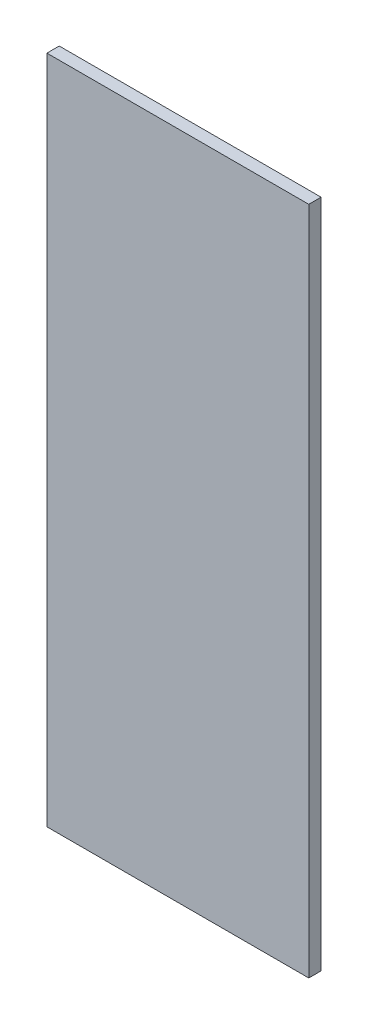
ISO-10303-21;
HEADER;
FILE_DESCRIPTION(('STEP AP214'),'2;1');
FILE_NAME('part.step','',(''),(''),'','','');
FILE_SCHEMA(('AUTOMOTIVE_DESIGN { 1 0 10303 214 1 1 1 1 }'));
ENDSEC;
DATA;
#1=APPLICATION_CONTEXT('core data for automotive mechanical design processes');
#2=APPLICATION_PROTOCOL_DEFINITION('international standard','automotive_design',2000,#1);
#3=PRODUCT_CONTEXT('',#1,'mechanical');
#4=PRODUCT('Part','Part','',(#3));
#5=PRODUCT_RELATED_PRODUCT_CATEGORY('part','',(#4));
#6=PRODUCT_DEFINITION_FORMATION('','',#4);
#7=PRODUCT_DEFINITION_CONTEXT('part definition',#1,'design');
#8=PRODUCT_DEFINITION('design','',#6,#7);
#9=PRODUCT_DEFINITION_SHAPE('','',#8);
#10=(LENGTH_UNIT() NAMED_UNIT(*) SI_UNIT(.MILLI.,.METRE.));
#11=(NAMED_UNIT(*) PLANE_ANGLE_UNIT() SI_UNIT($,.RADIAN.));
#12=(NAMED_UNIT(*) SI_UNIT($,.STERADIAN.) SOLID_ANGLE_UNIT());
#13=UNCERTAINTY_MEASURE_WITH_UNIT(LENGTH_MEASURE(1.E-05),#10,'distance_accuracy_value','');
#14=(GEOMETRIC_REPRESENTATION_CONTEXT(3) GLOBAL_UNCERTAINTY_ASSIGNED_CONTEXT((#13)) GLOBAL_UNIT_ASSIGNED_CONTEXT((#10,
#11,#12)) REPRESENTATION_CONTEXT('',''));
#15=CARTESIAN_POINT('',(0.,0.,0.));
#16=DIRECTION('',(0.,0.,1.));
#17=DIRECTION('',(1.,0.,0.));
#18=AXIS2_PLACEMENT_3D('',#15,#16,#17);
#19=CARTESIAN_POINT('',(0.,0.,1.6));
#20=DIRECTION('',(1.,0.,0.));
#21=DIRECTION('',(0.,0.,-1.));
#22=AXIS2_PLACEMENT_3D('',#19,#20,#21);
#23=PLANE('',#22);
#24=DIRECTION('',(0.,-1.,0.));
#25=VECTOR('',#24,1.);
#26=CARTESIAN_POINT('',(0.,0.,0.));
#27=LINE('',#26,#25);
#28=CARTESIAN_POINT('',(0.,0.,0.));
#29=VERTEX_POINT('',#28);
#30=CARTESIAN_POINT('',(0.,-87.,0.));
#31=VERTEX_POINT('',#30);
#32=EDGE_CURVE('E96',#29,#31,#27,.T.);
#33=ORIENTED_EDGE('',*,*,#32,.T.);
#34=DIRECTION('',(0.,0.,-1.));
#35=VECTOR('',#34,1.);
#36=CARTESIAN_POINT('',(0.,-87.,1.6));
#37=LINE('',#36,#35);
#38=CARTESIAN_POINT('',(0.,-87.,1.6));
#39=VERTEX_POINT('',#38);
#40=EDGE_CURVE('E11',#39,#31,#37,.T.);
#41=ORIENTED_EDGE('',*,*,#40,.F.);
#42=DIRECTION('',(0.,-1.,0.));
#43=VECTOR('',#42,1.);
#44=CARTESIAN_POINT('',(0.,0.,1.6));
#45=LINE('',#44,#43);
#46=CARTESIAN_POINT('',(0.,0.,1.6));
#47=VERTEX_POINT('',#46);
#48=EDGE_CURVE('E84',#47,#39,#45,.T.);
#49=ORIENTED_EDGE('',*,*,#48,.F.);
#50=DIRECTION('',(0.,0.,-1.));
#51=VECTOR('',#50,1.);
#52=CARTESIAN_POINT('',(0.,0.,1.6));
#53=LINE('',#52,#51);
#54=EDGE_CURVE('E92',#47,#29,#53,.T.);
#55=ORIENTED_EDGE('',*,*,#54,.T.);
#56=EDGE_LOOP('',(#33,#41,#49,#55));
#57=FACE_BOUND('',#56,.T.);
#58=ADVANCED_FACE('F33',(#57),#23,.F.);
#59=CARTESIAN_POINT('',(0.,-87.,1.6));
#60=DIRECTION('',(0.,1.,0.));
#61=DIRECTION('',(0.,0.,1.));
#62=AXIS2_PLACEMENT_3D('',#59,#60,#61);
#63=PLANE('',#62);
#64=DIRECTION('',(1.,0.,0.));
#65=VECTOR('',#64,1.);
#66=CARTESIAN_POINT('',(0.,-87.,0.));
#67=LINE('',#66,#65);
#68=CARTESIAN_POINT('',(34.,-87.,0.));
#69=VERTEX_POINT('',#68);
#70=EDGE_CURVE('E88',#31,#69,#67,.T.);
#71=ORIENTED_EDGE('',*,*,#70,.T.);
#72=DIRECTION('',(0.,0.,-1.));
#73=VECTOR('',#72,1.);
#74=CARTESIAN_POINT('',(34.,-87.,1.6));
#75=LINE('',#74,#73);
#76=CARTESIAN_POINT('',(34.,-87.,1.6));
#77=VERTEX_POINT('',#76);
#78=EDGE_CURVE('E41',#77,#69,#75,.T.);
#79=ORIENTED_EDGE('',*,*,#78,.F.);
#80=DIRECTION('',(1.,0.,0.));
#81=VECTOR('',#80,1.);
#82=CARTESIAN_POINT('',(0.,-87.,1.6));
#83=LINE('',#82,#81);
#84=EDGE_CURVE('E79',#39,#77,#83,.T.);
#85=ORIENTED_EDGE('',*,*,#84,.F.);
#86=ORIENTED_EDGE('',*,*,#40,.T.);
#87=EDGE_LOOP('',(#71,#79,#85,#86));
#88=FACE_BOUND('',#87,.T.);
#89=ADVANCED_FACE('F87',(#88),#63,.F.);
#90=CARTESIAN_POINT('',(34.,0.,1.6));
#91=DIRECTION('',(-1.,0.,0.));
#92=DIRECTION('',(0.,-1.,0.));
#93=AXIS2_PLACEMENT_3D('',#90,#91,#92);
#94=PLANE('',#93);
#95=DIRECTION('',(0.,1.,0.));
#96=VECTOR('',#95,1.);
#97=CARTESIAN_POINT('',(34.,0.,0.));
#98=LINE('',#97,#96);
#99=CARTESIAN_POINT('',(34.,0.,0.));
#100=VERTEX_POINT('',#99);
#101=EDGE_CURVE('E66',#69,#100,#98,.T.);
#102=ORIENTED_EDGE('',*,*,#101,.T.);
#103=DIRECTION('',(0.,0.,-1.));
#104=VECTOR('',#103,1.);
#105=CARTESIAN_POINT('',(34.,0.,1.6));
#106=LINE('',#105,#104);
#107=CARTESIAN_POINT('',(34.,0.,1.6));
#108=VERTEX_POINT('',#107);
#109=EDGE_CURVE('E89',#108,#100,#106,.T.);
#110=ORIENTED_EDGE('',*,*,#109,.F.);
#111=DIRECTION('',(0.,1.,0.));
#112=VECTOR('',#111,1.);
#113=CARTESIAN_POINT('',(34.,0.,1.6));
#114=LINE('',#113,#112);
#115=EDGE_CURVE('E82',#77,#108,#114,.T.);
#116=ORIENTED_EDGE('',*,*,#115,.F.);
#117=ORIENTED_EDGE('',*,*,#78,.T.);
#118=EDGE_LOOP('',(#102,#110,#116,#117));
#119=FACE_BOUND('',#118,.T.);
#120=ADVANCED_FACE('F90',(#119),#94,.F.);
#121=CARTESIAN_POINT('',(0.,0.,1.6));
#122=DIRECTION('',(0.,-1.,0.));
#123=DIRECTION('',(0.,0.,-1.));
#124=AXIS2_PLACEMENT_3D('',#121,#122,#123);
#125=PLANE('',#124);
#126=DIRECTION('',(-1.,0.,0.));
#127=VECTOR('',#126,1.);
#128=CARTESIAN_POINT('',(0.,0.,0.));
#129=LINE('',#128,#127);
#130=EDGE_CURVE('E72',#100,#29,#129,.T.);
#131=ORIENTED_EDGE('',*,*,#130,.T.);
#132=ORIENTED_EDGE('',*,*,#54,.F.);
#133=DIRECTION('',(-1.,0.,0.));
#134=VECTOR('',#133,1.);
#135=CARTESIAN_POINT('',(0.,0.,1.6));
#136=LINE('',#135,#134);
#137=EDGE_CURVE('E49',#108,#47,#136,.T.);
#138=ORIENTED_EDGE('',*,*,#137,.F.);
#139=ORIENTED_EDGE('',*,*,#109,.T.);
#140=EDGE_LOOP('',(#131,#132,#138,#139));
#141=FACE_BOUND('',#140,.T.);
#142=ADVANCED_FACE('F103',(#141),#125,.F.);
#143=CARTESIAN_POINT('',(0.,0.,1.6));
#144=DIRECTION('',(0.,0.,1.));
#145=DIRECTION('',(1.,0.,0.));
#146=AXIS2_PLACEMENT_3D('',#143,#144,#145);
#147=PLANE('',#146);
#148=ORIENTED_EDGE('',*,*,#48,.T.);
#149=ORIENTED_EDGE('',*,*,#84,.T.);
#150=ORIENTED_EDGE('',*,*,#115,.T.);
#151=ORIENTED_EDGE('',*,*,#137,.T.);
#152=EDGE_LOOP('',(#148,#149,#150,#151));
#153=FACE_BOUND('',#152,.T.);
#154=ADVANCED_FACE('F80',(#153),#147,.T.);
#155=CARTESIAN_POINT('',(0.,0.,0.));
#156=DIRECTION('',(0.,0.,1.));
#157=DIRECTION('',(1.,0.,0.));
#158=AXIS2_PLACEMENT_3D('',#155,#156,#157);
#159=PLANE('',#158);
#160=ORIENTED_EDGE('',*,*,#32,.F.);
#161=ORIENTED_EDGE('',*,*,#130,.F.);
#162=ORIENTED_EDGE('',*,*,#101,.F.);
#163=ORIENTED_EDGE('',*,*,#70,.F.);
#164=EDGE_LOOP('',(#160,#161,#162,#163));
#165=FACE_BOUND('',#164,.T.);
#166=ADVANCED_FACE('F106',(#165),#159,.F.);
#167=CLOSED_SHELL('',(#58,#89,#120,#142,#154,#166));
#168=MANIFOLD_SOLID_BREP('B2',#167);
#169=ADVANCED_BREP_SHAPE_REPRESENTATION('',(#18,#168),#14);
#170=SHAPE_DEFINITION_REPRESENTATION(#9,#169);
ENDSEC;
END-ISO-10303-21;
